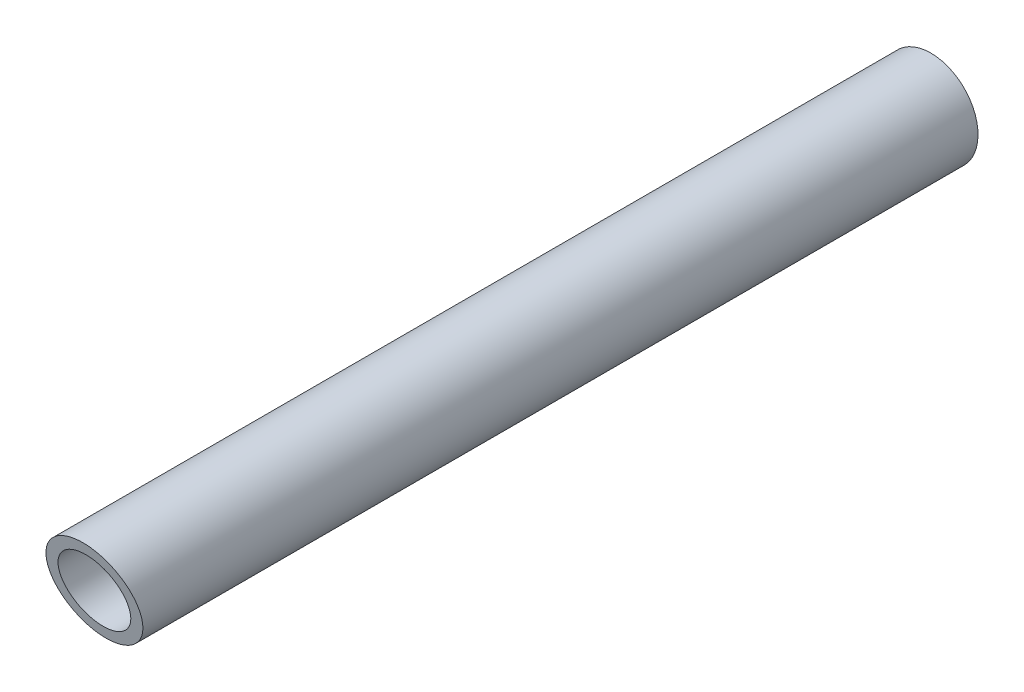
ISO-10303-21;
HEADER;
FILE_DESCRIPTION(('STEP AP214'),'2;1');
FILE_NAME('part.step','',(''),(''),'','','');
FILE_SCHEMA(('AUTOMOTIVE_DESIGN { 1 0 10303 214 1 1 1 1 }'));
ENDSEC;
DATA;
#1=APPLICATION_CONTEXT('core data for automotive mechanical design processes');
#2=APPLICATION_PROTOCOL_DEFINITION('international standard','automotive_design',2000,#1);
#3=PRODUCT_CONTEXT('',#1,'mechanical');
#4=PRODUCT('Part','Part','',(#3));
#5=PRODUCT_RELATED_PRODUCT_CATEGORY('part','',(#4));
#6=PRODUCT_DEFINITION_FORMATION('','',#4);
#7=PRODUCT_DEFINITION_CONTEXT('part definition',#1,'design');
#8=PRODUCT_DEFINITION('design','',#6,#7);
#9=PRODUCT_DEFINITION_SHAPE('','',#8);
#10=(LENGTH_UNIT() NAMED_UNIT(*) SI_UNIT(.MILLI.,.METRE.));
#11=(NAMED_UNIT(*) PLANE_ANGLE_UNIT() SI_UNIT($,.RADIAN.));
#12=(NAMED_UNIT(*) SI_UNIT($,.STERADIAN.) SOLID_ANGLE_UNIT());
#13=UNCERTAINTY_MEASURE_WITH_UNIT(LENGTH_MEASURE(1.E-05),#10,'distance_accuracy_value','');
#14=(GEOMETRIC_REPRESENTATION_CONTEXT(3) GLOBAL_UNCERTAINTY_ASSIGNED_CONTEXT((#13)) GLOBAL_UNIT_ASSIGNED_CONTEXT((#10,
#11,#12)) REPRESENTATION_CONTEXT('',''));
#15=CARTESIAN_POINT('',(0.,0.,0.));
#16=DIRECTION('',(0.,0.,1.));
#17=DIRECTION('',(1.,0.,0.));
#18=AXIS2_PLACEMENT_3D('',#15,#16,#17);
#19=CARTESIAN_POINT('',(0.,0.,114.3));
#20=DIRECTION('',(0.,0.,-1.));
#21=DIRECTION('',(-1.,0.,0.));
#22=AXIS2_PLACEMENT_3D('',#19,#20,#21);
#23=CYLINDRICAL_SURFACE('',#22,12.7);
#24=CARTESIAN_POINT('',(0.,0.,-114.3));
#25=DIRECTION('',(0.,0.,1.));
#26=DIRECTION('',(1.,0.,0.));
#27=AXIS2_PLACEMENT_3D('',#24,#25,#26);
#28=CIRCLE('',#27,12.7);
#29=CARTESIAN_POINT('',(9.21288893606811,-8.74143451909775,-114.3));
#30=VERTEX_POINT('',#29);
#31=CARTESIAN_POINT('',(-9.21288893606812,-8.74143451909774,-114.3));
#32=VERTEX_POINT('',#31);
#33=EDGE_CURVE('E80',#30,#32,#28,.T.);
#34=ORIENTED_EDGE('',*,*,#33,.T.);
#35=CARTESIAN_POINT('',(0.,0.,-150.044911155661));
#36=DIRECTION('',(0.,0.971375247556,0.237550265071459));
#37=DIRECTION('',(0.,0.237550265071459,-0.971375247556));
#38=AXIS2_PLACEMENT_3D('',#35,#36,#37);
#39=ELLIPSE('',#38,53.4623693060483,12.7);
#40=EDGE_CURVE('E55',#32,#30,#39,.T.);
#41=ORIENTED_EDGE('',*,*,#40,.T.);
#42=EDGE_LOOP('',(#34,#41));
#43=FACE_BOUND('',#42,.T.);
#44=CARTESIAN_POINT('',(0.,0.,111.194209139055));
#45=DIRECTION('',(0.,-0.237550265071459,0.971375247556));
#46=DIRECTION('',(0.,-0.971375247556,-0.237550265071459));
#47=AXIS2_PLACEMENT_3D('',#44,#45,#46);
#48=ELLIPSE('',#47,13.0742470862352,12.7);
#49=CARTESIAN_POINT('',(0.,-12.7,108.08841827811));
#50=VERTEX_POINT('',#49);
#51=EDGE_CURVE('E70',#50,#50,#48,.T.);
#52=ORIENTED_EDGE('',*,*,#51,.F.);
#53=EDGE_LOOP('',(#52));
#54=FACE_BOUND('',#53,.T.);
#55=ADVANCED_FACE('F40',(#43,#54),#23,.T.);
#56=CARTESIAN_POINT('',(0.,0.,114.3));
#57=DIRECTION('',(0.,0.,-1.));
#58=DIRECTION('',(-1.,0.,0.));
#59=AXIS2_PLACEMENT_3D('',#56,#57,#58);
#60=CYLINDRICAL_SURFACE('',#59,9.525);
#61=CARTESIAN_POINT('',(0.,0.,-150.044911155661));
#62=DIRECTION('',(0.,0.971375247556,0.237550265071459));
#63=DIRECTION('',(0.,0.237550265071459,-0.971375247556));
#64=AXIS2_PLACEMENT_3D('',#61,#62,#63);
#65=ELLIPSE('',#64,40.0967769795362,9.525);
#66=CARTESIAN_POINT('',(-3.78324563679473,-8.74143451909774,-114.3));
#67=VERTEX_POINT('',#66);
#68=CARTESIAN_POINT('',(3.78324563679471,-8.74143451909776,-114.3));
#69=VERTEX_POINT('',#68);
#70=EDGE_CURVE('E64',#67,#69,#65,.T.);
#71=ORIENTED_EDGE('',*,*,#70,.F.);
#72=CARTESIAN_POINT('',(0.,0.,-114.3));
#73=DIRECTION('',(0.,0.,1.));
#74=DIRECTION('',(1.,0.,0.));
#75=AXIS2_PLACEMENT_3D('',#72,#73,#74);
#76=CIRCLE('',#75,9.525);
#77=EDGE_CURVE('E75',#69,#67,#76,.T.);
#78=ORIENTED_EDGE('',*,*,#77,.F.);
#79=EDGE_LOOP('',(#71,#78));
#80=FACE_BOUND('',#79,.T.);
#81=CARTESIAN_POINT('',(0.,0.,111.194209139055));
#82=DIRECTION('',(0.,-0.237550265071459,0.971375247556));
#83=DIRECTION('',(0.,-0.971375247556,-0.237550265071459));
#84=AXIS2_PLACEMENT_3D('',#81,#82,#83);
#85=ELLIPSE('',#84,9.80568531467638,9.525);
#86=CARTESIAN_POINT('',(0.,-9.525,108.864865993346));
#87=VERTEX_POINT('',#86);
#88=EDGE_CURVE('E81',#87,#87,#85,.T.);
#89=ORIENTED_EDGE('',*,*,#88,.T.);
#90=EDGE_LOOP('',(#89));
#91=FACE_BOUND('',#90,.T.);
#92=ADVANCED_FACE('F73',(#80,#91),#60,.F.);
#93=CARTESIAN_POINT('',(0.,0.,-114.3));
#94=DIRECTION('',(0.,0.,1.));
#95=DIRECTION('',(1.,0.,0.));
#96=AXIS2_PLACEMENT_3D('',#93,#94,#95);
#97=PLANE('',#96);
#98=ORIENTED_EDGE('',*,*,#33,.F.);
#99=DIRECTION('',(-1.,0.,0.));
#100=VECTOR('',#99,1.);
#101=CARTESIAN_POINT('',(0.,-8.74143451909775,-114.3));
#102=LINE('',#101,#100);
#103=EDGE_CURVE('E12',#30,#69,#102,.T.);
#104=ORIENTED_EDGE('',*,*,#103,.T.);
#105=ORIENTED_EDGE('',*,*,#77,.T.);
#106=EDGE_CURVE('E43',#67,#32,#102,.T.);
#107=ORIENTED_EDGE('',*,*,#106,.T.);
#108=EDGE_LOOP('',(#98,#104,#105,#107));
#109=FACE_BOUND('',#108,.T.);
#110=ADVANCED_FACE('F78',(#109),#97,.F.);
#111=CARTESIAN_POINT('',(0.,-25.6581135227802,104.919505636052));
#112=DIRECTION('',(0.,-0.237550265071459,0.971375247556));
#113=DIRECTION('',(0.,-0.971375247556,-0.237550265071459));
#114=AXIS2_PLACEMENT_3D('',#111,#112,#113);
#115=PLANE('',#114);
#116=ORIENTED_EDGE('',*,*,#88,.F.);
#117=EDGE_LOOP('',(#116));
#118=FACE_BOUND('',#117,.T.);
#119=ORIENTED_EDGE('',*,*,#51,.T.);
#120=EDGE_LOOP('',(#119));
#121=FACE_BOUND('',#120,.T.);
#122=ADVANCED_FACE('F97',(#118,#121),#115,.T.);
#123=CARTESIAN_POINT('',(0.,-34.6229304003857,-8.46705360761022));
#124=DIRECTION('',(0.,0.971375247556,0.237550265071459));
#125=DIRECTION('',(0.,-0.237550265071459,0.971375247556));
#126=AXIS2_PLACEMENT_3D('',#123,#124,#125);
#127=PLANE('',#126);
#128=ORIENTED_EDGE('',*,*,#103,.F.);
#129=ORIENTED_EDGE('',*,*,#40,.F.);
#130=ORIENTED_EDGE('',*,*,#106,.F.);
#131=ORIENTED_EDGE('',*,*,#70,.T.);
#132=EDGE_LOOP('',(#128,#129,#130,#131));
#133=FACE_BOUND('',#132,.T.);
#134=ADVANCED_FACE('F63',(#133),#127,.F.);
#135=CLOSED_SHELL('',(#55,#92,#110,#122,#134));
#136=MANIFOLD_SOLID_BREP('B2',#135);
#137=ADVANCED_BREP_SHAPE_REPRESENTATION('',(#18,#136),#14);
#138=SHAPE_DEFINITION_REPRESENTATION(#9,#137);
ENDSEC;
END-ISO-10303-21;
